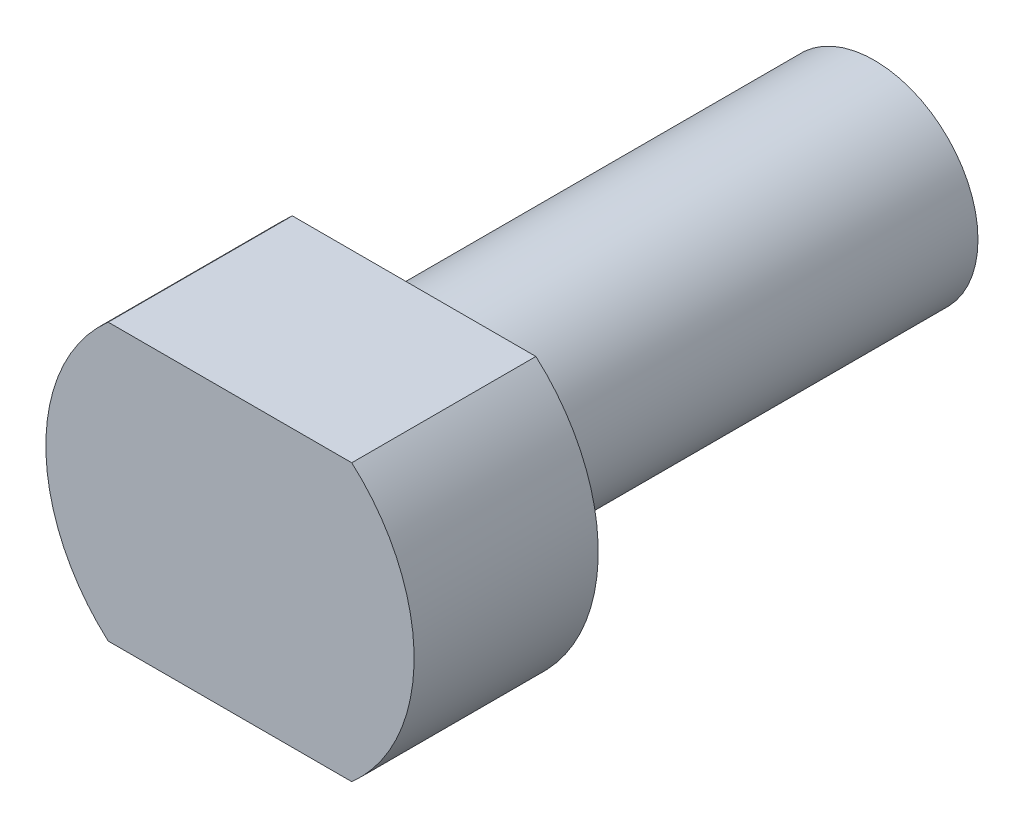
ISO-10303-21;
HEADER;
FILE_DESCRIPTION(('STEP AP214'),'2;1');
FILE_NAME('part.step','',(''),(''),'','','');
FILE_SCHEMA(('AUTOMOTIVE_DESIGN { 1 0 10303 214 1 1 1 1 }'));
ENDSEC;
DATA;
#1=APPLICATION_CONTEXT('core data for automotive mechanical design processes');
#2=APPLICATION_PROTOCOL_DEFINITION('international standard','automotive_design',2000,#1);
#3=PRODUCT_CONTEXT('',#1,'mechanical');
#4=PRODUCT('Part','Part','',(#3));
#5=PRODUCT_RELATED_PRODUCT_CATEGORY('part','',(#4));
#6=PRODUCT_DEFINITION_FORMATION('','',#4);
#7=PRODUCT_DEFINITION_CONTEXT('part definition',#1,'design');
#8=PRODUCT_DEFINITION('design','',#6,#7);
#9=PRODUCT_DEFINITION_SHAPE('','',#8);
#10=(LENGTH_UNIT() NAMED_UNIT(*) SI_UNIT(.MILLI.,.METRE.));
#11=(NAMED_UNIT(*) PLANE_ANGLE_UNIT() SI_UNIT($,.RADIAN.));
#12=(NAMED_UNIT(*) SI_UNIT($,.STERADIAN.) SOLID_ANGLE_UNIT());
#13=UNCERTAINTY_MEASURE_WITH_UNIT(LENGTH_MEASURE(1.E-05),#10,'distance_accuracy_value','');
#14=(GEOMETRIC_REPRESENTATION_CONTEXT(3) GLOBAL_UNCERTAINTY_ASSIGNED_CONTEXT((#13)) GLOBAL_UNIT_ASSIGNED_CONTEXT((#10,
#11,#12)) REPRESENTATION_CONTEXT('',''));
#15=CARTESIAN_POINT('',(0.,0.,0.));
#16=DIRECTION('',(0.,0.,1.));
#17=DIRECTION('',(1.,0.,0.));
#18=AXIS2_PLACEMENT_3D('',#15,#16,#17);
#19=CARTESIAN_POINT('',(0.,0.,14.));
#20=DIRECTION('',(0.,0.,-1.));
#21=DIRECTION('',(-1.,0.,0.));
#22=AXIS2_PLACEMENT_3D('',#19,#20,#21);
#23=CYLINDRICAL_SURFACE('',#22,4.);
#24=CARTESIAN_POINT('',(0.,0.,14.));
#25=DIRECTION('',(0.,0.,1.));
#26=DIRECTION('',(1.,0.,0.));
#27=AXIS2_PLACEMENT_3D('',#24,#25,#26);
#28=CIRCLE('',#27,4.);
#29=CARTESIAN_POINT('',(-2.64575131106459,3.,14.));
#30=VERTEX_POINT('',#29);
#31=CARTESIAN_POINT('',(-2.64575131106459,-3.,14.));
#32=VERTEX_POINT('',#31);
#33=EDGE_CURVE('E92',#30,#32,#28,.T.);
#34=ORIENTED_EDGE('',*,*,#33,.F.);
#35=DIRECTION('',(0.,0.,1.));
#36=VECTOR('',#35,1.);
#37=CARTESIAN_POINT('',(-2.64575131106459,3.,10.));
#38=LINE('',#37,#36);
#39=CARTESIAN_POINT('',(-2.64575131106459,3.,10.));
#40=VERTEX_POINT('',#39);
#41=EDGE_CURVE('E77',#40,#30,#38,.T.);
#42=ORIENTED_EDGE('',*,*,#41,.F.);
#43=CARTESIAN_POINT('',(0.,0.,10.));
#44=DIRECTION('',(0.,0.,1.));
#45=DIRECTION('',(1.,0.,0.));
#46=AXIS2_PLACEMENT_3D('',#43,#44,#45);
#47=CIRCLE('',#46,4.);
#48=CARTESIAN_POINT('',(-2.64575131106459,-3.,10.));
#49=VERTEX_POINT('',#48);
#50=EDGE_CURVE('E99',#40,#49,#47,.T.);
#51=ORIENTED_EDGE('',*,*,#50,.T.);
#52=DIRECTION('',(0.,0.,1.));
#53=VECTOR('',#52,1.);
#54=CARTESIAN_POINT('',(-2.64575131106459,-3.,10.));
#55=LINE('',#54,#53);
#56=EDGE_CURVE('E53',#49,#32,#55,.T.);
#57=ORIENTED_EDGE('',*,*,#56,.T.);
#58=EDGE_LOOP('',(#34,#42,#51,#57));
#59=FACE_BOUND('',#58,.T.);
#60=ADVANCED_FACE('F38',(#59),#23,.T.);
#61=CARTESIAN_POINT('',(0.,0.,10.));
#62=DIRECTION('',(0.,0.,-1.));
#63=DIRECTION('',(-1.,0.,0.));
#64=AXIS2_PLACEMENT_3D('',#61,#62,#63);
#65=CYLINDRICAL_SURFACE('',#64,2.25);
#66=CARTESIAN_POINT('',(0.,0.,10.));
#67=DIRECTION('',(0.,0.,1.));
#68=DIRECTION('',(1.,0.,0.));
#69=AXIS2_PLACEMENT_3D('',#66,#67,#68);
#70=CIRCLE('',#69,2.25);
#71=CARTESIAN_POINT('',(2.25,0.,10.));
#72=VERTEX_POINT('',#71);
#73=EDGE_CURVE('E12',#72,#72,#70,.T.);
#74=ORIENTED_EDGE('',*,*,#73,.F.);
#75=EDGE_LOOP('',(#74));
#76=FACE_BOUND('',#75,.T.);
#77=CARTESIAN_POINT('',(0.,0.,0.));
#78=DIRECTION('',(0.,0.,1.));
#79=DIRECTION('',(1.,0.,0.));
#80=AXIS2_PLACEMENT_3D('',#77,#78,#79);
#81=CIRCLE('',#80,2.25);
#82=CARTESIAN_POINT('',(2.25,0.,0.));
#83=VERTEX_POINT('',#82);
#84=EDGE_CURVE('E42',#83,#83,#81,.T.);
#85=ORIENTED_EDGE('',*,*,#84,.T.);
#86=EDGE_LOOP('',(#85));
#87=FACE_BOUND('',#86,.T.);
#88=ADVANCED_FACE('F40',(#76,#87),#65,.T.);
#89=CARTESIAN_POINT('',(0.,0.,0.));
#90=DIRECTION('',(0.,0.,1.));
#91=DIRECTION('',(1.,0.,0.));
#92=AXIS2_PLACEMENT_3D('',#89,#90,#91);
#93=PLANE('',#92);
#94=ORIENTED_EDGE('',*,*,#84,.F.);
#95=EDGE_LOOP('',(#94));
#96=FACE_BOUND('',#95,.T.);
#97=ADVANCED_FACE('F119',(#96),#93,.F.);
#98=CARTESIAN_POINT('',(2.64575131106459,-3.,10.));
#99=VERTEX_POINT('',#98);
#100=CARTESIAN_POINT('',(2.64575131106459,3.,10.));
#101=VERTEX_POINT('',#100);
#102=EDGE_CURVE('E104',#99,#101,#47,.T.);
#103=ORIENTED_EDGE('',*,*,#102,.T.);
#104=DIRECTION('',(0.,0.,1.));
#105=VECTOR('',#104,1.);
#106=CARTESIAN_POINT('',(2.64575131106459,3.,10.));
#107=LINE('',#106,#105);
#108=CARTESIAN_POINT('',(2.64575131106459,3.,14.));
#109=VERTEX_POINT('',#108);
#110=EDGE_CURVE('E61',#101,#109,#107,.T.);
#111=ORIENTED_EDGE('',*,*,#110,.T.);
#112=CARTESIAN_POINT('',(2.64575131106459,-3.,14.));
#113=VERTEX_POINT('',#112);
#114=EDGE_CURVE('E94',#113,#109,#28,.T.);
#115=ORIENTED_EDGE('',*,*,#114,.F.);
#116=DIRECTION('',(0.,0.,1.));
#117=VECTOR('',#116,1.);
#118=CARTESIAN_POINT('',(2.64575131106459,-3.,10.));
#119=LINE('',#118,#117);
#120=EDGE_CURVE('E112',#99,#113,#119,.T.);
#121=ORIENTED_EDGE('',*,*,#120,.F.);
#122=EDGE_LOOP('',(#103,#111,#115,#121));
#123=FACE_BOUND('',#122,.T.);
#124=ADVANCED_FACE('F117',(#123),#23,.T.);
#125=CARTESIAN_POINT('',(0.,0.,14.));
#126=DIRECTION('',(0.,0.,1.));
#127=DIRECTION('',(1.,0.,0.));
#128=AXIS2_PLACEMENT_3D('',#125,#126,#127);
#129=PLANE('',#128);
#130=DIRECTION('',(1.,0.,0.));
#131=VECTOR('',#130,1.);
#132=CARTESIAN_POINT('',(-2.64575131106459,3.,14.));
#133=LINE('',#132,#131);
#134=EDGE_CURVE('E80',#30,#109,#133,.T.);
#135=ORIENTED_EDGE('',*,*,#134,.F.);
#136=ORIENTED_EDGE('',*,*,#33,.T.);
#137=DIRECTION('',(-1.,0.,0.));
#138=VECTOR('',#137,1.);
#139=CARTESIAN_POINT('',(-2.64575131106459,-3.,14.));
#140=LINE('',#139,#138);
#141=EDGE_CURVE('E95',#113,#32,#140,.T.);
#142=ORIENTED_EDGE('',*,*,#141,.F.);
#143=ORIENTED_EDGE('',*,*,#114,.T.);
#144=EDGE_LOOP('',(#135,#136,#142,#143));
#145=FACE_BOUND('',#144,.T.);
#146=ADVANCED_FACE('F90',(#145),#129,.T.);
#147=CARTESIAN_POINT('',(0.,0.,10.));
#148=DIRECTION('',(0.,0.,1.));
#149=DIRECTION('',(1.,0.,0.));
#150=AXIS2_PLACEMENT_3D('',#147,#148,#149);
#151=PLANE('',#150);
#152=ORIENTED_EDGE('',*,*,#73,.T.);
#153=EDGE_LOOP('',(#152));
#154=FACE_BOUND('',#153,.T.);
#155=ORIENTED_EDGE('',*,*,#50,.F.);
#156=DIRECTION('',(1.,0.,0.));
#157=VECTOR('',#156,1.);
#158=CARTESIAN_POINT('',(-2.64575131106459,3.,10.));
#159=LINE('',#158,#157);
#160=EDGE_CURVE('E81',#40,#101,#159,.T.);
#161=ORIENTED_EDGE('',*,*,#160,.T.);
#162=ORIENTED_EDGE('',*,*,#102,.F.);
#163=DIRECTION('',(-1.,0.,0.));
#164=VECTOR('',#163,1.);
#165=CARTESIAN_POINT('',(-2.64575131106459,-3.,10.));
#166=LINE('',#165,#164);
#167=EDGE_CURVE('E102',#99,#49,#166,.T.);
#168=ORIENTED_EDGE('',*,*,#167,.T.);
#169=EDGE_LOOP('',(#155,#161,#162,#168));
#170=FACE_BOUND('',#169,.T.);
#171=ADVANCED_FACE('F115',(#154,#170),#151,.F.);
#172=CARTESIAN_POINT('',(-2.64575131106459,-3.,10.));
#173=DIRECTION('',(0.,1.,0.));
#174=DIRECTION('',(0.,0.,1.));
#175=AXIS2_PLACEMENT_3D('',#172,#173,#174);
#176=PLANE('',#175);
#177=ORIENTED_EDGE('',*,*,#141,.T.);
#178=ORIENTED_EDGE('',*,*,#56,.F.);
#179=ORIENTED_EDGE('',*,*,#167,.F.);
#180=ORIENTED_EDGE('',*,*,#120,.T.);
#181=EDGE_LOOP('',(#177,#178,#179,#180));
#182=FACE_BOUND('',#181,.T.);
#183=ADVANCED_FACE('F116',(#182),#176,.F.);
#184=CARTESIAN_POINT('',(-2.64575131106459,3.,10.));
#185=DIRECTION('',(0.,-1.,0.));
#186=DIRECTION('',(0.,0.,-1.));
#187=AXIS2_PLACEMENT_3D('',#184,#185,#186);
#188=PLANE('',#187);
#189=ORIENTED_EDGE('',*,*,#134,.T.);
#190=ORIENTED_EDGE('',*,*,#110,.F.);
#191=ORIENTED_EDGE('',*,*,#160,.F.);
#192=ORIENTED_EDGE('',*,*,#41,.T.);
#193=EDGE_LOOP('',(#189,#190,#191,#192));
#194=FACE_BOUND('',#193,.T.);
#195=ADVANCED_FACE('F79',(#194),#188,.F.);
#196=CLOSED_SHELL('',(#60,#88,#97,#124,#146,#171,#183,#195));
#197=MANIFOLD_SOLID_BREP('B2',#196);
#198=ADVANCED_BREP_SHAPE_REPRESENTATION('',(#18,#197),#14);
#199=SHAPE_DEFINITION_REPRESENTATION(#9,#198);
ENDSEC;
END-ISO-10303-21;
